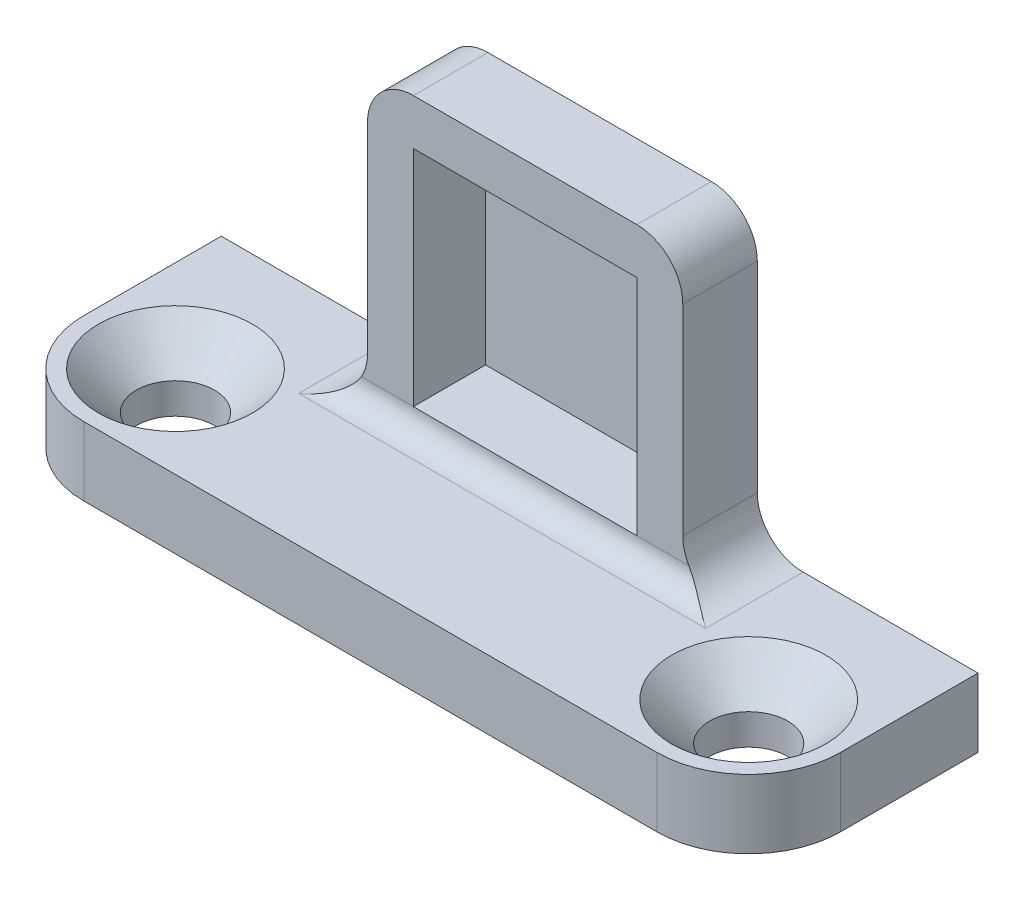
ISO-10303-21;
HEADER;
FILE_DESCRIPTION(('STEP AP214'),'2;1');
FILE_NAME('part.step','',(''),(''),'','','');
FILE_SCHEMA(('AUTOMOTIVE_DESIGN { 1 0 10303 214 1 1 1 1 }'));
ENDSEC;
DATA;
#1=APPLICATION_CONTEXT('core data for automotive mechanical design processes');
#2=APPLICATION_PROTOCOL_DEFINITION('international standard','automotive_design',2000,#1);
#3=PRODUCT_CONTEXT('',#1,'mechanical');
#4=PRODUCT('Part','Part','',(#3));
#5=PRODUCT_RELATED_PRODUCT_CATEGORY('part','',(#4));
#6=PRODUCT_DEFINITION_FORMATION('','',#4);
#7=PRODUCT_DEFINITION_CONTEXT('part definition',#1,'design');
#8=PRODUCT_DEFINITION('design','',#6,#7);
#9=PRODUCT_DEFINITION_SHAPE('','',#8);
#10=(LENGTH_UNIT() NAMED_UNIT(*) SI_UNIT(.MILLI.,.METRE.));
#11=(NAMED_UNIT(*) PLANE_ANGLE_UNIT() SI_UNIT($,.RADIAN.));
#12=(NAMED_UNIT(*) SI_UNIT($,.STERADIAN.) SOLID_ANGLE_UNIT());
#13=UNCERTAINTY_MEASURE_WITH_UNIT(LENGTH_MEASURE(1.E-05),#10,'distance_accuracy_value','');
#14=(GEOMETRIC_REPRESENTATION_CONTEXT(3) GLOBAL_UNCERTAINTY_ASSIGNED_CONTEXT((#13)) GLOBAL_UNIT_ASSIGNED_CONTEXT((#10,
#11,#12)) REPRESENTATION_CONTEXT('',''));
#15=CARTESIAN_POINT('',(0.,0.,0.));
#16=DIRECTION('',(0.,0.,1.));
#17=DIRECTION('',(1.,0.,0.));
#18=AXIS2_PLACEMENT_3D('',#15,#16,#17);
#19=CARTESIAN_POINT('',(16.5,3.,0.));
#20=DIRECTION('',(1.,0.,0.));
#21=DIRECTION('',(0.,0.,-1.));
#22=AXIS2_PLACEMENT_3D('',#19,#20,#21);
#23=PLANE('',#22);
#24=DIRECTION('',(0.,0.,1.));
#25=VECTOR('',#24,1.);
#26=CARTESIAN_POINT('',(16.5,3.,0.));
#27=LINE('',#26,#25);
#28=CARTESIAN_POINT('',(16.5,3.,0.));
#29=VERTEX_POINT('',#28);
#30=CARTESIAN_POINT('',(16.5,3.,6.));
#31=VERTEX_POINT('',#30);
#32=EDGE_CURVE('E247',#29,#31,#27,.T.);
#33=ORIENTED_EDGE('',*,*,#32,.T.);
#34=DIRECTION('',(0.,-1.,0.));
#35=VECTOR('',#34,1.);
#36=CARTESIAN_POINT('',(16.5,0.,6.));
#37=LINE('',#36,#35);
#38=CARTESIAN_POINT('',(16.5,0.,6.));
#39=VERTEX_POINT('',#38);
#40=EDGE_CURVE('E295',#31,#39,#37,.T.);
#41=ORIENTED_EDGE('',*,*,#40,.T.);
#42=DIRECTION('',(0.,0.,1.));
#43=VECTOR('',#42,1.);
#44=CARTESIAN_POINT('',(16.5,0.,0.));
#45=LINE('',#44,#43);
#46=CARTESIAN_POINT('',(16.5,0.,0.));
#47=VERTEX_POINT('',#46);
#48=EDGE_CURVE('E262',#47,#39,#45,.T.);
#49=ORIENTED_EDGE('',*,*,#48,.F.);
#50=DIRECTION('',(0.,-1.,0.));
#51=VECTOR('',#50,1.);
#52=CARTESIAN_POINT('',(16.5,3.,0.));
#53=LINE('',#52,#51);
#54=EDGE_CURVE('E274',#29,#47,#53,.T.);
#55=ORIENTED_EDGE('',*,*,#54,.F.);
#56=EDGE_LOOP('',(#33,#41,#49,#55));
#57=FACE_BOUND('',#56,.T.);
#58=ADVANCED_FACE('F35',(#57),#23,.T.);
#59=CARTESIAN_POINT('',(0.,3.,0.));
#60=DIRECTION('',(0.,0.,-1.));
#61=DIRECTION('',(-1.,0.,0.));
#62=AXIS2_PLACEMENT_3D('',#59,#60,#61);
#63=PLANE('',#62);
#64=DIRECTION('',(0.,1.,0.));
#65=VECTOR('',#64,1.);
#66=CARTESIAN_POINT('',(-6.875,3.,0.));
#67=LINE('',#66,#65);
#68=CARTESIAN_POINT('',(-6.875,5.,0.));
#69=VERTEX_POINT('',#68);
#70=CARTESIAN_POINT('',(-6.875,13.75,0.));
#71=VERTEX_POINT('',#70);
#72=EDGE_CURVE('E211',#69,#71,#67,.T.);
#73=ORIENTED_EDGE('',*,*,#72,.T.);
#74=CARTESIAN_POINT('',(-4.875,13.75,0.));
#75=DIRECTION('',(0.,0.,-1.));
#76=DIRECTION('',(-1.,0.,0.));
#77=AXIS2_PLACEMENT_3D('',#74,#75,#76);
#78=CIRCLE('',#77,2.);
#79=CARTESIAN_POINT('',(-4.875,15.75,0.));
#80=VERTEX_POINT('',#79);
#81=EDGE_CURVE('E315',#71,#80,#78,.T.);
#82=ORIENTED_EDGE('',*,*,#81,.T.);
#83=DIRECTION('',(1.,0.,0.));
#84=VECTOR('',#83,1.);
#85=CARTESIAN_POINT('',(6.875,15.75,0.));
#86=LINE('',#85,#84);
#87=CARTESIAN_POINT('',(4.875,15.75,0.));
#88=VERTEX_POINT('',#87);
#89=EDGE_CURVE('E229',#80,#88,#86,.T.);
#90=ORIENTED_EDGE('',*,*,#89,.T.);
#91=CARTESIAN_POINT('',(4.875,13.75,0.));
#92=DIRECTION('',(0.,0.,-1.));
#93=DIRECTION('',(-1.,0.,0.));
#94=AXIS2_PLACEMENT_3D('',#91,#92,#93);
#95=CIRCLE('',#94,2.);
#96=CARTESIAN_POINT('',(6.875,13.75,0.));
#97=VERTEX_POINT('',#96);
#98=EDGE_CURVE('E313',#88,#97,#95,.T.);
#99=ORIENTED_EDGE('',*,*,#98,.T.);
#100=DIRECTION('',(0.,-1.,0.));
#101=VECTOR('',#100,1.);
#102=CARTESIAN_POINT('',(6.875,3.,0.));
#103=LINE('',#102,#101);
#104=CARTESIAN_POINT('',(6.875,5.,0.));
#105=VERTEX_POINT('',#104);
#106=EDGE_CURVE('E220',#97,#105,#103,.T.);
#107=ORIENTED_EDGE('',*,*,#106,.T.);
#108=CARTESIAN_POINT('',(8.875,5.,0.));
#109=DIRECTION('',(0.,0.,-1.));
#110=DIRECTION('',(-1.,0.,0.));
#111=AXIS2_PLACEMENT_3D('',#108,#109,#110);
#112=CIRCLE('',#111,2.);
#113=CARTESIAN_POINT('',(8.875,3.,0.));
#114=VERTEX_POINT('',#113);
#115=EDGE_CURVE('E330',#105,#114,#112,.F.);
#116=ORIENTED_EDGE('',*,*,#115,.T.);
#117=DIRECTION('',(1.,0.,0.));
#118=VECTOR('',#117,1.);
#119=CARTESIAN_POINT('',(0.,3.,0.));
#120=LINE('',#119,#118);
#121=EDGE_CURVE('E250',#114,#29,#120,.T.);
#122=ORIENTED_EDGE('',*,*,#121,.T.);
#123=ORIENTED_EDGE('',*,*,#54,.T.);
#124=DIRECTION('',(1.,0.,0.));
#125=VECTOR('',#124,1.);
#126=CARTESIAN_POINT('',(0.,0.,0.));
#127=LINE('',#126,#125);
#128=CARTESIAN_POINT('',(-16.5,0.,0.));
#129=VERTEX_POINT('',#128);
#130=EDGE_CURVE('E265',#129,#47,#127,.T.);
#131=ORIENTED_EDGE('',*,*,#130,.F.);
#132=DIRECTION('',(0.,-1.,0.));
#133=VECTOR('',#132,1.);
#134=CARTESIAN_POINT('',(-16.5,3.,0.));
#135=LINE('',#134,#133);
#136=CARTESIAN_POINT('',(-16.5,3.,0.));
#137=VERTEX_POINT('',#136);
#138=EDGE_CURVE('E261',#137,#129,#135,.T.);
#139=ORIENTED_EDGE('',*,*,#138,.F.);
#140=CARTESIAN_POINT('',(-8.875,3.,0.));
#141=VERTEX_POINT('',#140);
#142=EDGE_CURVE('E252',#137,#141,#120,.T.);
#143=ORIENTED_EDGE('',*,*,#142,.T.);
#144=CARTESIAN_POINT('',(-8.875,5.,0.));
#145=DIRECTION('',(0.,0.,-1.));
#146=DIRECTION('',(-1.,0.,0.));
#147=AXIS2_PLACEMENT_3D('',#144,#145,#146);
#148=CIRCLE('',#147,2.);
#149=EDGE_CURVE('E326',#141,#69,#148,.F.);
#150=ORIENTED_EDGE('',*,*,#149,.T.);
#151=EDGE_LOOP('',(#73,#82,#90,#99,#107,#116,#122,#123,#131,#139,#143,#150));
#152=FACE_BOUND('',#151,.T.);
#153=ADVANCED_FACE('F367',(#152),#63,.T.);
#154=CARTESIAN_POINT('',(-16.5,3.,0.));
#155=DIRECTION('',(1.,0.,0.));
#156=DIRECTION('',(0.,0.,-1.));
#157=AXIS2_PLACEMENT_3D('',#154,#155,#156);
#158=PLANE('',#157);
#159=DIRECTION('',(0.,0.,1.));
#160=VECTOR('',#159,1.);
#161=CARTESIAN_POINT('',(-16.5,0.,0.));
#162=LINE('',#161,#160);
#163=CARTESIAN_POINT('',(-16.5,0.,5.99999999999999));
#164=VERTEX_POINT('',#163);
#165=EDGE_CURVE('E268',#129,#164,#162,.T.);
#166=ORIENTED_EDGE('',*,*,#165,.T.);
#167=DIRECTION('',(0.,-1.,0.));
#168=VECTOR('',#167,1.);
#169=CARTESIAN_POINT('',(-16.5,3.,5.99999999999999));
#170=LINE('',#169,#168);
#171=CARTESIAN_POINT('',(-16.5,3.,5.99999999999999));
#172=VERTEX_POINT('',#171);
#173=EDGE_CURVE('E289',#164,#172,#170,.F.);
#174=ORIENTED_EDGE('',*,*,#173,.T.);
#175=DIRECTION('',(0.,0.,1.));
#176=VECTOR('',#175,1.);
#177=CARTESIAN_POINT('',(-16.5,3.,0.));
#178=LINE('',#177,#176);
#179=EDGE_CURVE('E255',#137,#172,#178,.T.);
#180=ORIENTED_EDGE('',*,*,#179,.F.);
#181=ORIENTED_EDGE('',*,*,#138,.T.);
#182=EDGE_LOOP('',(#166,#174,#180,#181));
#183=FACE_BOUND('',#182,.T.);
#184=ADVANCED_FACE('F373',(#183),#158,.F.);
#185=CARTESIAN_POINT('',(0.,3.,9.99999999999999));
#186=DIRECTION('',(0.,0.,-1.));
#187=DIRECTION('',(-1.,0.,0.));
#188=AXIS2_PLACEMENT_3D('',#185,#186,#187);
#189=PLANE('',#188);
#190=DIRECTION('',(1.,0.,0.));
#191=VECTOR('',#190,1.);
#192=CARTESIAN_POINT('',(0.,3.,9.99999999999999));
#193=LINE('',#192,#191);
#194=CARTESIAN_POINT('',(-12.5,3.,9.99999999999999));
#195=VERTEX_POINT('',#194);
#196=CARTESIAN_POINT('',(12.5,3.,10.));
#197=VERTEX_POINT('',#196);
#198=EDGE_CURVE('E258',#195,#197,#193,.T.);
#199=ORIENTED_EDGE('',*,*,#198,.F.);
#200=DIRECTION('',(0.,-1.,0.));
#201=VECTOR('',#200,1.);
#202=CARTESIAN_POINT('',(-12.5,3.,9.99999999999999));
#203=LINE('',#202,#201);
#204=CARTESIAN_POINT('',(-12.5,0.,9.99999999999999));
#205=VERTEX_POINT('',#204);
#206=EDGE_CURVE('E282',#195,#205,#203,.T.);
#207=ORIENTED_EDGE('',*,*,#206,.T.);
#208=DIRECTION('',(1.,0.,0.));
#209=VECTOR('',#208,1.);
#210=CARTESIAN_POINT('',(0.,0.,9.99999999999999));
#211=LINE('',#210,#209);
#212=CARTESIAN_POINT('',(12.5,0.,10.));
#213=VERTEX_POINT('',#212);
#214=EDGE_CURVE('E251',#205,#213,#211,.T.);
#215=ORIENTED_EDGE('',*,*,#214,.T.);
#216=DIRECTION('',(0.,-1.,0.));
#217=VECTOR('',#216,1.);
#218=CARTESIAN_POINT('',(12.5,3.,10.));
#219=LINE('',#218,#217);
#220=EDGE_CURVE('E276',#213,#197,#219,.F.);
#221=ORIENTED_EDGE('',*,*,#220,.T.);
#222=EDGE_LOOP('',(#199,#207,#215,#221));
#223=FACE_BOUND('',#222,.T.);
#224=ADVANCED_FACE('F401',(#223),#189,.F.);
#225=CARTESIAN_POINT('',(0.,3.,0.));
#226=DIRECTION('',(0.,1.,0.));
#227=DIRECTION('',(0.,0.,1.));
#228=AXIS2_PLACEMENT_3D('',#225,#226,#227);
#229=PLANE('',#228);
#230=DIRECTION('',(-1.,0.,0.));
#231=VECTOR('',#230,1.);
#232=CARTESIAN_POINT('',(-8.875,3.,4.25));
#233=LINE('',#232,#231);
#234=CARTESIAN_POINT('',(8.875,3.,4.25));
#235=VERTEX_POINT('',#234);
#236=CARTESIAN_POINT('',(-8.875,3.,4.25));
#237=VERTEX_POINT('',#236);
#238=EDGE_CURVE('E334',#235,#237,#233,.T.);
#239=ORIENTED_EDGE('',*,*,#238,.T.);
#240=DIRECTION('',(0.,0.,-1.));
#241=VECTOR('',#240,1.);
#242=CARTESIAN_POINT('',(-8.875,3.,0.));
#243=LINE('',#242,#241);
#244=EDGE_CURVE('E300',#237,#141,#243,.T.);
#245=ORIENTED_EDGE('',*,*,#244,.T.);
#246=ORIENTED_EDGE('',*,*,#142,.F.);
#247=ORIENTED_EDGE('',*,*,#179,.T.);
#248=CARTESIAN_POINT('',(-12.5,3.,5.99999999999999));
#249=DIRECTION('',(0.,1.,0.));
#250=DIRECTION('',(0.,0.,1.));
#251=AXIS2_PLACEMENT_3D('',#248,#249,#250);
#252=CIRCLE('',#251,4.);
#253=EDGE_CURVE('E293',#172,#195,#252,.T.);
#254=ORIENTED_EDGE('',*,*,#253,.T.);
#255=ORIENTED_EDGE('',*,*,#198,.T.);
#256=CARTESIAN_POINT('',(12.5,3.,6.));
#257=DIRECTION('',(0.,1.,0.));
#258=DIRECTION('',(0.,0.,1.));
#259=AXIS2_PLACEMENT_3D('',#256,#257,#258);
#260=CIRCLE('',#259,4.);
#261=EDGE_CURVE('E291',#197,#31,#260,.T.);
#262=ORIENTED_EDGE('',*,*,#261,.T.);
#263=ORIENTED_EDGE('',*,*,#32,.F.);
#264=ORIENTED_EDGE('',*,*,#121,.F.);
#265=DIRECTION('',(0.,0.,-1.));
#266=VECTOR('',#265,1.);
#267=CARTESIAN_POINT('',(8.875,3.,3.25));
#268=LINE('',#267,#266);
#269=EDGE_CURVE('E298',#114,#235,#268,.F.);
#270=ORIENTED_EDGE('',*,*,#269,.T.);
#271=EDGE_LOOP('',(#239,#245,#246,#247,#254,#255,#262,#263,#264,#270));
#272=FACE_BOUND('',#271,.T.);
#273=CARTESIAN_POINT('',(-12.5,3.,6.));
#274=DIRECTION('',(0.,1.,0.));
#275=DIRECTION('',(0.,0.,1.));
#276=AXIS2_PLACEMENT_3D('',#273,#274,#275);
#277=CIRCLE('',#276,3.36);
#278=CARTESIAN_POINT('',(-12.5,3.,9.36));
#279=VERTEX_POINT('',#278);
#280=EDGE_CURVE('E226',#279,#279,#277,.T.);
#281=ORIENTED_EDGE('',*,*,#280,.F.);
#282=EDGE_LOOP('',(#281));
#283=FACE_BOUND('',#282,.T.);
#284=CARTESIAN_POINT('',(12.5,3.,5.99999999999999));
#285=DIRECTION('',(0.,1.,0.));
#286=DIRECTION('',(0.,0.,1.));
#287=AXIS2_PLACEMENT_3D('',#284,#285,#286);
#288=CIRCLE('',#287,3.36);
#289=CARTESIAN_POINT('',(12.5,3.,9.35999999999999));
#290=VERTEX_POINT('',#289);
#291=EDGE_CURVE('E240',#290,#290,#288,.T.);
#292=ORIENTED_EDGE('',*,*,#291,.F.);
#293=EDGE_LOOP('',(#292));
#294=FACE_BOUND('',#293,.T.);
#295=ADVANCED_FACE('F395',(#272,#283,#294),#229,.T.);
#296=CARTESIAN_POINT('',(0.,0.,0.));
#297=DIRECTION('',(0.,1.,0.));
#298=DIRECTION('',(0.,0.,1.));
#299=AXIS2_PLACEMENT_3D('',#296,#297,#298);
#300=PLANE('',#299);
#301=CARTESIAN_POINT('',(-12.5,0.,6.));
#302=DIRECTION('',(0.,1.,0.));
#303=DIRECTION('',(0.,0.,1.));
#304=AXIS2_PLACEMENT_3D('',#301,#302,#303);
#305=CIRCLE('',#304,1.7);
#306=CARTESIAN_POINT('',(-12.5,0.,7.69999999999999));
#307=VERTEX_POINT('',#306);
#308=EDGE_CURVE('E239',#307,#307,#305,.T.);
#309=ORIENTED_EDGE('',*,*,#308,.T.);
#310=EDGE_LOOP('',(#309));
#311=FACE_BOUND('',#310,.T.);
#312=CARTESIAN_POINT('',(12.5,0.,5.99999999999999));
#313=DIRECTION('',(0.,1.,0.));
#314=DIRECTION('',(0.,0.,1.));
#315=AXIS2_PLACEMENT_3D('',#312,#313,#314);
#316=CIRCLE('',#315,1.7);
#317=CARTESIAN_POINT('',(12.5,0.,7.69999999999999));
#318=VERTEX_POINT('',#317);
#319=EDGE_CURVE('E246',#318,#318,#316,.T.);
#320=ORIENTED_EDGE('',*,*,#319,.T.);
#321=EDGE_LOOP('',(#320));
#322=FACE_BOUND('',#321,.T.);
#323=ORIENTED_EDGE('',*,*,#214,.F.);
#324=CARTESIAN_POINT('',(-12.5,0.,5.99999999999999));
#325=DIRECTION('',(0.,1.,0.));
#326=DIRECTION('',(0.,0.,1.));
#327=AXIS2_PLACEMENT_3D('',#324,#325,#326);
#328=CIRCLE('',#327,4.);
#329=EDGE_CURVE('E287',#205,#164,#328,.F.);
#330=ORIENTED_EDGE('',*,*,#329,.T.);
#331=ORIENTED_EDGE('',*,*,#165,.F.);
#332=ORIENTED_EDGE('',*,*,#130,.T.);
#333=ORIENTED_EDGE('',*,*,#48,.T.);
#334=CARTESIAN_POINT('',(12.5,0.,6.));
#335=DIRECTION('',(0.,1.,0.));
#336=DIRECTION('',(0.,0.,1.));
#337=AXIS2_PLACEMENT_3D('',#334,#335,#336);
#338=CIRCLE('',#337,4.);
#339=EDGE_CURVE('E285',#39,#213,#338,.F.);
#340=ORIENTED_EDGE('',*,*,#339,.T.);
#341=EDGE_LOOP('',(#323,#330,#331,#332,#333,#340));
#342=FACE_BOUND('',#341,.T.);
#343=ADVANCED_FACE('F420',(#311,#322,#342),#300,.F.);
#344=CARTESIAN_POINT('',(12.5,3.,5.99999999999999));
#345=DIRECTION('',(0.,1.,0.));
#346=DIRECTION('',(0.,0.,1.));
#347=AXIS2_PLACEMENT_3D('',#344,#345,#346);
#348=CYLINDRICAL_SURFACE('',#347,1.7);
#349=CARTESIAN_POINT('',(12.5,1.34,5.99999999999999));
#350=DIRECTION('',(0.,1.,0.));
#351=DIRECTION('',(0.,0.,1.));
#352=AXIS2_PLACEMENT_3D('',#349,#350,#351);
#353=CIRCLE('',#352,1.7);
#354=CARTESIAN_POINT('',(12.5,1.34,7.69999999999999));
#355=VERTEX_POINT('',#354);
#356=EDGE_CURVE('E243',#355,#355,#353,.T.);
#357=ORIENTED_EDGE('',*,*,#356,.T.);
#358=EDGE_LOOP('',(#357));
#359=FACE_BOUND('',#358,.T.);
#360=ORIENTED_EDGE('',*,*,#319,.F.);
#361=EDGE_LOOP('',(#360));
#362=FACE_BOUND('',#361,.T.);
#363=ADVANCED_FACE('F422',(#359,#362),#348,.F.);
#364=CARTESIAN_POINT('',(12.5,3.,5.99999999999999));
#365=DIRECTION('',(0.,1.,0.));
#366=DIRECTION('',(0.,0.,1.));
#367=AXIS2_PLACEMENT_3D('',#364,#365,#366);
#368=CONICAL_SURFACE('',#367,3.36,0.785398163397448);
#369=ORIENTED_EDGE('',*,*,#356,.F.);
#370=EDGE_LOOP('',(#369));
#371=FACE_BOUND('',#370,.T.);
#372=ORIENTED_EDGE('',*,*,#291,.T.);
#373=EDGE_LOOP('',(#372));
#374=FACE_BOUND('',#373,.T.);
#375=ADVANCED_FACE('F429',(#371,#374),#368,.F.);
#376=CARTESIAN_POINT('',(-12.5,3.,6.));
#377=DIRECTION('',(0.,1.,0.));
#378=DIRECTION('',(0.,0.,1.));
#379=AXIS2_PLACEMENT_3D('',#376,#377,#378);
#380=CYLINDRICAL_SURFACE('',#379,1.7);
#381=CARTESIAN_POINT('',(-12.5,1.34,6.));
#382=DIRECTION('',(0.,1.,0.));
#383=DIRECTION('',(0.,0.,1.));
#384=AXIS2_PLACEMENT_3D('',#381,#382,#383);
#385=CIRCLE('',#384,1.7);
#386=CARTESIAN_POINT('',(-12.5,1.34,7.69999999999999));
#387=VERTEX_POINT('',#386);
#388=EDGE_CURVE('E236',#387,#387,#385,.T.);
#389=ORIENTED_EDGE('',*,*,#388,.T.);
#390=EDGE_LOOP('',(#389));
#391=FACE_BOUND('',#390,.T.);
#392=ORIENTED_EDGE('',*,*,#308,.F.);
#393=EDGE_LOOP('',(#392));
#394=FACE_BOUND('',#393,.T.);
#395=ADVANCED_FACE('F387',(#391,#394),#380,.F.);
#396=CARTESIAN_POINT('',(-12.5,3.,6.));
#397=DIRECTION('',(0.,1.,0.));
#398=DIRECTION('',(0.,0.,1.));
#399=AXIS2_PLACEMENT_3D('',#396,#397,#398);
#400=CONICAL_SURFACE('',#399,3.36,0.785398163397448);
#401=ORIENTED_EDGE('',*,*,#388,.F.);
#402=EDGE_LOOP('',(#401));
#403=FACE_BOUND('',#402,.T.);
#404=ORIENTED_EDGE('',*,*,#280,.T.);
#405=EDGE_LOOP('',(#404));
#406=FACE_BOUND('',#405,.T.);
#407=ADVANCED_FACE('F379',(#403,#406),#400,.F.);
#408=CARTESIAN_POINT('',(-12.5,3.,5.99999999999999));
#409=DIRECTION('',(0.,-1.,0.));
#410=DIRECTION('',(0.,0.,-1.));
#411=AXIS2_PLACEMENT_3D('',#408,#409,#410);
#412=CYLINDRICAL_SURFACE('',#411,4.);
#413=ORIENTED_EDGE('',*,*,#253,.F.);
#414=ORIENTED_EDGE('',*,*,#173,.F.);
#415=ORIENTED_EDGE('',*,*,#329,.F.);
#416=ORIENTED_EDGE('',*,*,#206,.F.);
#417=EDGE_LOOP('',(#413,#414,#415,#416));
#418=FACE_BOUND('',#417,.T.);
#419=ADVANCED_FACE('F377',(#418),#412,.T.);
#420=CARTESIAN_POINT('',(12.5,3.,6.));
#421=DIRECTION('',(0.,1.,0.));
#422=DIRECTION('',(0.,0.,1.));
#423=AXIS2_PLACEMENT_3D('',#420,#421,#422);
#424=CYLINDRICAL_SURFACE('',#423,4.);
#425=ORIENTED_EDGE('',*,*,#261,.F.);
#426=ORIENTED_EDGE('',*,*,#220,.F.);
#427=ORIENTED_EDGE('',*,*,#339,.F.);
#428=ORIENTED_EDGE('',*,*,#40,.F.);
#429=EDGE_LOOP('',(#425,#426,#427,#428));
#430=FACE_BOUND('',#429,.T.);
#431=ADVANCED_FACE('F349',(#430),#424,.T.);
#432=CARTESIAN_POINT('',(-6.875,3.,3.25));
#433=DIRECTION('',(-1.,0.,0.));
#434=DIRECTION('',(0.,0.,1.));
#435=AXIS2_PLACEMENT_3D('',#432,#433,#434);
#436=PLANE('',#435);
#437=ORIENTED_EDGE('',*,*,#72,.F.);
#438=DIRECTION('',(0.,0.,-1.));
#439=VECTOR('',#438,1.);
#440=CARTESIAN_POINT('',(-6.875,5.,3.25));
#441=LINE('',#440,#439);
#442=CARTESIAN_POINT('',(-6.875,5.,3.25));
#443=VERTEX_POINT('',#442);
#444=EDGE_CURVE('E306',#69,#443,#441,.F.);
#445=ORIENTED_EDGE('',*,*,#444,.T.);
#446=DIRECTION('',(0.,1.,0.));
#447=VECTOR('',#446,1.);
#448=CARTESIAN_POINT('',(-6.875,3.,3.25));
#449=LINE('',#448,#447);
#450=CARTESIAN_POINT('',(-6.875,13.75,3.25));
#451=VERTEX_POINT('',#450);
#452=EDGE_CURVE('E216',#443,#451,#449,.T.);
#453=ORIENTED_EDGE('',*,*,#452,.T.);
#454=DIRECTION('',(0.,0.,-1.));
#455=VECTOR('',#454,1.);
#456=CARTESIAN_POINT('',(-6.875,13.75,3.25));
#457=LINE('',#456,#455);
#458=EDGE_CURVE('E303',#451,#71,#457,.T.);
#459=ORIENTED_EDGE('',*,*,#458,.T.);
#460=EDGE_LOOP('',(#437,#445,#453,#459));
#461=FACE_BOUND('',#460,.T.);
#462=ADVANCED_FACE('F385',(#461),#436,.T.);
#463=CARTESIAN_POINT('',(6.875,3.,3.25));
#464=DIRECTION('',(1.,0.,0.));
#465=DIRECTION('',(0.,1.,0.));
#466=AXIS2_PLACEMENT_3D('',#463,#464,#465);
#467=PLANE('',#466);
#468=DIRECTION('',(0.,-1.,0.));
#469=VECTOR('',#468,1.);
#470=CARTESIAN_POINT('',(6.875,3.,3.25));
#471=LINE('',#470,#469);
#472=CARTESIAN_POINT('',(6.875,13.75,3.25));
#473=VERTEX_POINT('',#472);
#474=CARTESIAN_POINT('',(6.875,5.,3.25));
#475=VERTEX_POINT('',#474);
#476=EDGE_CURVE('E223',#473,#475,#471,.T.);
#477=ORIENTED_EDGE('',*,*,#476,.T.);
#478=DIRECTION('',(0.,0.,-1.));
#479=VECTOR('',#478,1.);
#480=CARTESIAN_POINT('',(6.875,5.,0.));
#481=LINE('',#480,#479);
#482=EDGE_CURVE('E310',#475,#105,#481,.T.);
#483=ORIENTED_EDGE('',*,*,#482,.T.);
#484=ORIENTED_EDGE('',*,*,#106,.F.);
#485=DIRECTION('',(0.,0.,-1.));
#486=VECTOR('',#485,1.);
#487=CARTESIAN_POINT('',(6.875,13.75,3.25));
#488=LINE('',#487,#486);
#489=EDGE_CURVE('E308',#97,#473,#488,.F.);
#490=ORIENTED_EDGE('',*,*,#489,.T.);
#491=EDGE_LOOP('',(#477,#483,#484,#490));
#492=FACE_BOUND('',#491,.T.);
#493=ADVANCED_FACE('F529',(#492),#467,.T.);
#494=CARTESIAN_POINT('',(6.875,15.75,3.25));
#495=DIRECTION('',(0.,1.,0.));
#496=DIRECTION('',(0.,0.,1.));
#497=AXIS2_PLACEMENT_3D('',#494,#495,#496);
#498=PLANE('',#497);
#499=ORIENTED_EDGE('',*,*,#89,.F.);
#500=DIRECTION('',(0.,0.,-1.));
#501=VECTOR('',#500,1.);
#502=CARTESIAN_POINT('',(-4.875,15.75,3.25));
#503=LINE('',#502,#501);
#504=CARTESIAN_POINT('',(-4.875,15.75,3.25));
#505=VERTEX_POINT('',#504);
#506=EDGE_CURVE('E320',#80,#505,#503,.F.);
#507=ORIENTED_EDGE('',*,*,#506,.T.);
#508=DIRECTION('',(1.,0.,0.));
#509=VECTOR('',#508,1.);
#510=CARTESIAN_POINT('',(6.875,15.75,3.25));
#511=LINE('',#510,#509);
#512=CARTESIAN_POINT('',(4.875,15.75,3.25));
#513=VERTEX_POINT('',#512);
#514=EDGE_CURVE('E219',#505,#513,#511,.T.);
#515=ORIENTED_EDGE('',*,*,#514,.T.);
#516=DIRECTION('',(0.,0.,-1.));
#517=VECTOR('',#516,1.);
#518=CARTESIAN_POINT('',(4.875,15.75,3.25));
#519=LINE('',#518,#517);
#520=EDGE_CURVE('E317',#513,#88,#519,.T.);
#521=ORIENTED_EDGE('',*,*,#520,.T.);
#522=EDGE_LOOP('',(#499,#507,#515,#521));
#523=FACE_BOUND('',#522,.T.);
#524=ADVANCED_FACE('F463',(#523),#498,.T.);
#525=CARTESIAN_POINT('',(0.,0.,3.25));
#526=DIRECTION('',(0.,0.,1.));
#527=DIRECTION('',(1.,0.,0.));
#528=AXIS2_PLACEMENT_3D('',#525,#526,#527);
#529=PLANE('',#528);
#530=CARTESIAN_POINT('',(-8.875,5.,3.25));
#531=DIRECTION('',(0.,0.,1.));
#532=DIRECTION('',(1.,0.,0.));
#533=AXIS2_PLACEMENT_3D('',#530,#531,#532);
#534=CIRCLE('',#533,2.);
#535=CARTESIAN_POINT('',(-7.14294919243113,4.,3.25));
#536=VERTEX_POINT('',#535);
#537=EDGE_CURVE('E328',#443,#536,#534,.F.);
#538=ORIENTED_EDGE('',*,*,#537,.T.);
#539=DIRECTION('',(-1.,0.,0.));
#540=VECTOR('',#539,1.);
#541=CARTESIAN_POINT('',(8.875,4.,3.25));
#542=LINE('',#541,#540);
#543=CARTESIAN_POINT('',(-4.875,4.,3.25));
#544=VERTEX_POINT('',#543);
#545=EDGE_CURVE('E338',#536,#544,#542,.F.);
#546=ORIENTED_EDGE('',*,*,#545,.T.);
#547=DIRECTION('',(0.,-1.,0.));
#548=VECTOR('',#547,1.);
#549=CARTESIAN_POINT('',(-4.875,13.75,3.25));
#550=LINE('',#549,#548);
#551=CARTESIAN_POINT('',(-4.875,13.75,3.25));
#552=VERTEX_POINT('',#551);
#553=EDGE_CURVE('E199',#552,#544,#550,.T.);
#554=ORIENTED_EDGE('',*,*,#553,.F.);
#555=DIRECTION('',(-1.,0.,0.));
#556=VECTOR('',#555,1.);
#557=CARTESIAN_POINT('',(4.875,13.75,3.25));
#558=LINE('',#557,#556);
#559=CARTESIAN_POINT('',(4.875,13.75,3.25));
#560=VERTEX_POINT('',#559);
#561=EDGE_CURVE('E205',#560,#552,#558,.T.);
#562=ORIENTED_EDGE('',*,*,#561,.F.);
#563=DIRECTION('',(0.,1.,0.));
#564=VECTOR('',#563,1.);
#565=CARTESIAN_POINT('',(4.875,13.75,3.25));
#566=LINE('',#565,#564);
#567=CARTESIAN_POINT('',(4.875,4.,3.25));
#568=VERTEX_POINT('',#567);
#569=EDGE_CURVE('E179',#568,#560,#566,.T.);
#570=ORIENTED_EDGE('',*,*,#569,.F.);
#571=DIRECTION('',(-1.,0.,0.));
#572=VECTOR('',#571,1.);
#573=CARTESIAN_POINT('',(8.875,4.,3.25));
#574=LINE('',#573,#572);
#575=CARTESIAN_POINT('',(7.14294919243112,4.,3.25));
#576=VERTEX_POINT('',#575);
#577=EDGE_CURVE('E56',#568,#576,#574,.F.);
#578=ORIENTED_EDGE('',*,*,#577,.T.);
#579=CARTESIAN_POINT('',(8.875,5.,3.25));
#580=DIRECTION('',(0.,0.,1.));
#581=DIRECTION('',(1.,0.,0.));
#582=AXIS2_PLACEMENT_3D('',#579,#580,#581);
#583=CIRCLE('',#582,2.);
#584=EDGE_CURVE('E332',#576,#475,#583,.F.);
#585=ORIENTED_EDGE('',*,*,#584,.T.);
#586=ORIENTED_EDGE('',*,*,#476,.F.);
#587=CARTESIAN_POINT('',(4.875,13.75,3.25));
#588=DIRECTION('',(0.,0.,1.));
#589=DIRECTION('',(1.,0.,0.));
#590=AXIS2_PLACEMENT_3D('',#587,#588,#589);
#591=CIRCLE('',#590,2.);
#592=EDGE_CURVE('E322',#473,#513,#591,.T.);
#593=ORIENTED_EDGE('',*,*,#592,.T.);
#594=ORIENTED_EDGE('',*,*,#514,.F.);
#595=CARTESIAN_POINT('',(-4.875,13.75,3.25));
#596=DIRECTION('',(0.,0.,1.));
#597=DIRECTION('',(1.,0.,0.));
#598=AXIS2_PLACEMENT_3D('',#595,#596,#597);
#599=CIRCLE('',#598,2.);
#600=EDGE_CURVE('E324',#505,#451,#599,.T.);
#601=ORIENTED_EDGE('',*,*,#600,.T.);
#602=ORIENTED_EDGE('',*,*,#452,.F.);
#603=EDGE_LOOP('',(#538,#546,#554,#562,#570,#578,#585,#586,#593,#594,#601,#602));
#604=FACE_BOUND('',#603,.T.);
#605=ADVANCED_FACE('F458',(#604),#529,.T.);
#606=CARTESIAN_POINT('',(4.875,13.75,0.0999999999999998));
#607=DIRECTION('',(1.,0.,0.));
#608=DIRECTION('',(0.,1.,0.));
#609=AXIS2_PLACEMENT_3D('',#606,#607,#608);
#610=PLANE('',#609);
#611=ORIENTED_EDGE('',*,*,#569,.T.);
#612=DIRECTION('',(0.,0.,1.));
#613=VECTOR('',#612,1.);
#614=CARTESIAN_POINT('',(4.875,13.75,0.0999999999999998));
#615=LINE('',#614,#613);
#616=CARTESIAN_POINT('',(4.875,13.75,0.0999999999999998));
#617=VERTEX_POINT('',#616);
#618=EDGE_CURVE('E173',#617,#560,#615,.T.);
#619=ORIENTED_EDGE('',*,*,#618,.F.);
#620=DIRECTION('',(0.,1.,0.));
#621=VECTOR('',#620,1.);
#622=CARTESIAN_POINT('',(4.875,13.75,0.0999999999999998));
#623=LINE('',#622,#621);
#624=CARTESIAN_POINT('',(4.875,4.,0.0999999999999998));
#625=VERTEX_POINT('',#624);
#626=EDGE_CURVE('E177',#625,#617,#623,.T.);
#627=ORIENTED_EDGE('',*,*,#626,.F.);
#628=DIRECTION('',(0.,0.,1.));
#629=VECTOR('',#628,1.);
#630=CARTESIAN_POINT('',(4.875,4.,0.0999999999999998));
#631=LINE('',#630,#629);
#632=EDGE_CURVE('E209',#625,#568,#631,.T.);
#633=ORIENTED_EDGE('',*,*,#632,.T.);
#634=EDGE_LOOP('',(#611,#619,#627,#633));
#635=FACE_BOUND('',#634,.T.);
#636=ADVANCED_FACE('F175',(#635),#610,.F.);
#637=CARTESIAN_POINT('',(4.875,4.,0.0999999999999998));
#638=DIRECTION('',(0.,-1.,0.));
#639=DIRECTION('',(0.,0.,-1.));
#640=AXIS2_PLACEMENT_3D('',#637,#638,#639);
#641=PLANE('',#640);
#642=DIRECTION('',(1.,0.,0.));
#643=VECTOR('',#642,1.);
#644=CARTESIAN_POINT('',(4.875,4.,3.25));
#645=LINE('',#644,#643);
#646=EDGE_CURVE('E196',#544,#568,#645,.T.);
#647=ORIENTED_EDGE('',*,*,#646,.T.);
#648=ORIENTED_EDGE('',*,*,#632,.F.);
#649=DIRECTION('',(1.,0.,0.));
#650=VECTOR('',#649,1.);
#651=CARTESIAN_POINT('',(4.875,4.,0.0999999999999998));
#652=LINE('',#651,#650);
#653=CARTESIAN_POINT('',(-4.875,4.,0.0999999999999998));
#654=VERTEX_POINT('',#653);
#655=EDGE_CURVE('E184',#654,#625,#652,.T.);
#656=ORIENTED_EDGE('',*,*,#655,.F.);
#657=DIRECTION('',(0.,0.,1.));
#658=VECTOR('',#657,1.);
#659=CARTESIAN_POINT('',(-4.875,4.,0.0999999999999998));
#660=LINE('',#659,#658);
#661=EDGE_CURVE('E212',#654,#544,#660,.T.);
#662=ORIENTED_EDGE('',*,*,#661,.T.);
#663=EDGE_LOOP('',(#647,#648,#656,#662));
#664=FACE_BOUND('',#663,.T.);
#665=ADVANCED_FACE('F474',(#664),#641,.F.);
#666=CARTESIAN_POINT('',(-4.875,13.75,0.0999999999999998));
#667=DIRECTION('',(-1.,0.,0.));
#668=DIRECTION('',(0.,-1.,0.));
#669=AXIS2_PLACEMENT_3D('',#666,#667,#668);
#670=PLANE('',#669);
#671=ORIENTED_EDGE('',*,*,#553,.T.);
#672=ORIENTED_EDGE('',*,*,#661,.F.);
#673=DIRECTION('',(0.,-1.,0.));
#674=VECTOR('',#673,1.);
#675=CARTESIAN_POINT('',(-4.875,13.75,0.0999999999999998));
#676=LINE('',#675,#674);
#677=CARTESIAN_POINT('',(-4.875,13.75,0.0999999999999998));
#678=VERTEX_POINT('',#677);
#679=EDGE_CURVE('E192',#678,#654,#676,.T.);
#680=ORIENTED_EDGE('',*,*,#679,.F.);
#681=DIRECTION('',(0.,0.,1.));
#682=VECTOR('',#681,1.);
#683=CARTESIAN_POINT('',(-4.875,13.75,0.0999999999999998));
#684=LINE('',#683,#682);
#685=EDGE_CURVE('E183',#678,#552,#684,.T.);
#686=ORIENTED_EDGE('',*,*,#685,.T.);
#687=EDGE_LOOP('',(#671,#672,#680,#686));
#688=FACE_BOUND('',#687,.T.);
#689=ADVANCED_FACE('F483',(#688),#670,.F.);
#690=CARTESIAN_POINT('',(4.875,13.75,0.0999999999999998));
#691=DIRECTION('',(0.,1.,0.));
#692=DIRECTION('',(0.,0.,1.));
#693=AXIS2_PLACEMENT_3D('',#690,#691,#692);
#694=PLANE('',#693);
#695=ORIENTED_EDGE('',*,*,#561,.T.);
#696=ORIENTED_EDGE('',*,*,#685,.F.);
#697=DIRECTION('',(-1.,0.,0.));
#698=VECTOR('',#697,1.);
#699=CARTESIAN_POINT('',(4.875,13.75,0.0999999999999998));
#700=LINE('',#699,#698);
#701=EDGE_CURVE('E187',#617,#678,#700,.T.);
#702=ORIENTED_EDGE('',*,*,#701,.F.);
#703=ORIENTED_EDGE('',*,*,#618,.T.);
#704=EDGE_LOOP('',(#695,#696,#702,#703));
#705=FACE_BOUND('',#704,.T.);
#706=ADVANCED_FACE('F188',(#705),#694,.F.);
#707=CARTESIAN_POINT('',(0.,0.,0.0999999999999998));
#708=DIRECTION('',(0.,0.,-1.));
#709=DIRECTION('',(-1.,0.,0.));
#710=AXIS2_PLACEMENT_3D('',#707,#708,#709);
#711=PLANE('',#710);
#712=ORIENTED_EDGE('',*,*,#626,.T.);
#713=ORIENTED_EDGE('',*,*,#701,.T.);
#714=ORIENTED_EDGE('',*,*,#679,.T.);
#715=ORIENTED_EDGE('',*,*,#655,.T.);
#716=EDGE_LOOP('',(#712,#713,#714,#715));
#717=FACE_BOUND('',#716,.T.);
#718=ADVANCED_FACE('F194',(#717),#711,.F.);
#719=CARTESIAN_POINT('',(-8.875,5.,0.));
#720=DIRECTION('',(0.,0.,1.));
#721=DIRECTION('',(1.,0.,0.));
#722=AXIS2_PLACEMENT_3D('',#719,#720,#721);
#723=CYLINDRICAL_SURFACE('',#722,2.);
#724=ORIENTED_EDGE('',*,*,#537,.F.);
#725=ORIENTED_EDGE('',*,*,#444,.F.);
#726=ORIENTED_EDGE('',*,*,#149,.F.);
#727=ORIENTED_EDGE('',*,*,#244,.F.);
#728=CARTESIAN_POINT('',(-7.14294919243113,4.,3.25));
#729=CARTESIAN_POINT('',(-7.16456119077684,3.96254044047365,3.24999980568836));
#730=CARTESIAN_POINT('',(-7.18738496198315,3.92583917864711,3.25210319796198));
#731=CARTESIAN_POINT('',(-7.2350917210063,3.85434356320049,3.26001340764259));
#732=CARTESIAN_POINT('',(-7.25996935201582,3.81954461931415,3.26581084038911));
#733=CARTESIAN_POINT('',(-7.31119040135561,3.75249844515592,3.28051235919617));
#734=CARTESIAN_POINT('',(-7.33751003404477,3.72022351684429,3.28937426984246));
#735=CARTESIAN_POINT('',(-7.3916543858414,3.65783971793181,3.3097852158221));
#736=CARTESIAN_POINT('',(-7.41948020246429,3.62773246511539,3.32133623142663));
#737=CARTESIAN_POINT('',(-7.51564684920934,3.52980188192177,3.36423276751056));
#738=CARTESIAN_POINT('',(-7.58698065113304,3.46717437431735,3.40092150342509));
#739=CARTESIAN_POINT('',(-7.73463626052194,3.35431082904296,3.48318766839412));
#740=CARTESIAN_POINT('',(-7.81098566230024,3.30415214096292,3.52881758821574));
#741=CARTESIAN_POINT('',(-7.99839927291761,3.19794475890171,3.64566540445564));
#742=CARTESIAN_POINT('',(-8.11099063977572,3.1477495749302,3.71975815567176));
#743=CARTESIAN_POINT('',(-8.33910128882741,3.06936277484821,3.87397939495328));
#744=CARTESIAN_POINT('',(-8.45461658619791,3.04114271871491,3.95409993406185));
#745=CARTESIAN_POINT('',(-8.66947174018588,3.00809073030031,4.1046835611499));
#746=CARTESIAN_POINT('',(-8.76862557205976,3.00037489576334,4.17478225234926));
#747=CARTESIAN_POINT('',(-8.8701314049216,3.00000444910877,4.24655738388493));
#748=CARTESIAN_POINT('',(-8.8725657315113,3.00000000518405,4.24827871283066));
#749=CARTESIAN_POINT('',(-8.875,3.,4.25));
#750=B_SPLINE_CURVE_WITH_KNOTS('',3,(#728,#729,#730,#731,#732,#733,#734,#735,#736,#737,#738,
#739,#740,#741,#742,#743,#744,#745,#746,#747,#748,#749),.UNSPECIFIED.,.F.,.F.,(4,2,2,2,2,2,2,2,
2,2,4),(0.,0.12959229529458,0.258856668652771,0.386408509268408,0.514054578529991,
0.817592410147224,1.1229686971365,1.55212503753218,1.98072504008937,2.34472916750579,
2.35367344935465),.UNSPECIFIED.);
#751=EDGE_CURVE('E49',#237,#536,#750,.F.);
#752=ORIENTED_EDGE('',*,*,#751,.T.);
#753=EDGE_LOOP('',(#724,#725,#726,#727,#752));
#754=FACE_BOUND('',#753,.T.);
#755=ADVANCED_FACE('F344',(#754),#723,.F.);
#756=CARTESIAN_POINT('',(8.875,5.,3.25));
#757=DIRECTION('',(0.,0.,1.));
#758=DIRECTION('',(1.,0.,0.));
#759=AXIS2_PLACEMENT_3D('',#756,#757,#758);
#760=CYLINDRICAL_SURFACE('',#759,2.);
#761=ORIENTED_EDGE('',*,*,#584,.F.);
#762=CARTESIAN_POINT('',(7.14294919243112,4.,3.25));
#763=CARTESIAN_POINT('',(7.16456119077684,3.96254044047365,3.24999980568836));
#764=CARTESIAN_POINT('',(7.18738496198315,3.92583917864711,3.25210319796198));
#765=CARTESIAN_POINT('',(7.23509172100629,3.85434356320049,3.26001340764259));
#766=CARTESIAN_POINT('',(7.25996935201582,3.81954461931415,3.26581084038911));
#767=CARTESIAN_POINT('',(7.31119040135561,3.75249844515592,3.28051235919617));
#768=CARTESIAN_POINT('',(7.33751003404477,3.72022351684429,3.28937426984246));
#769=CARTESIAN_POINT('',(7.39165438584139,3.65783971793181,3.3097852158221));
#770=CARTESIAN_POINT('',(7.41948020246429,3.62773246511539,3.32133623142663));
#771=CARTESIAN_POINT('',(7.51564684920934,3.52980188192177,3.36423276751056));
#772=CARTESIAN_POINT('',(7.58698065113304,3.46717437431735,3.40092150342509));
#773=CARTESIAN_POINT('',(7.73463626052194,3.35431082904296,3.48318766839412));
#774=CARTESIAN_POINT('',(7.81098566230024,3.30415214096292,3.52881758821574));
#775=CARTESIAN_POINT('',(7.99839927291761,3.19794475890171,3.64566540445564));
#776=CARTESIAN_POINT('',(8.11099063977571,3.1477495749302,3.71975815567176));
#777=CARTESIAN_POINT('',(8.33910128882741,3.06936277484821,3.87397939495328));
#778=CARTESIAN_POINT('',(8.45461658619791,3.04114271871491,3.95409993406185));
#779=CARTESIAN_POINT('',(8.66947174018588,3.00809073030031,4.1046835611499));
#780=CARTESIAN_POINT('',(8.76862557205976,3.00037489576334,4.17478225234926));
#781=CARTESIAN_POINT('',(8.8701314049216,3.00000444910877,4.24655738388493));
#782=CARTESIAN_POINT('',(8.87256573151129,3.00000000518405,4.24827871283066));
#783=CARTESIAN_POINT('',(8.875,3.,4.25));
#784=B_SPLINE_CURVE_WITH_KNOTS('',3,(#762,#763,#764,#765,#766,#767,#768,#769,#770,#771,#772,
#773,#774,#775,#776,#777,#778,#779,#780,#781,#782,#783),.UNSPECIFIED.,.F.,.F.,(4,2,2,2,2,2,2,2,
2,2,4),(0.,0.12959229529458,0.258856668652771,0.386408509268408,0.514054578529991,
0.817592410147224,1.1229686971365,1.55212503753218,1.98072504008937,2.34472916750579,
2.35367344935465),.UNSPECIFIED.);
#785=EDGE_CURVE('E11',#576,#235,#784,.T.);
#786=ORIENTED_EDGE('',*,*,#785,.T.);
#787=ORIENTED_EDGE('',*,*,#269,.F.);
#788=ORIENTED_EDGE('',*,*,#115,.F.);
#789=ORIENTED_EDGE('',*,*,#482,.F.);
#790=EDGE_LOOP('',(#761,#786,#787,#788,#789));
#791=FACE_BOUND('',#790,.T.);
#792=ADVANCED_FACE('F348',(#791),#760,.F.);
#793=CARTESIAN_POINT('',(-4.875,13.75,3.25));
#794=DIRECTION('',(0.,0.,-1.));
#795=DIRECTION('',(-1.,0.,0.));
#796=AXIS2_PLACEMENT_3D('',#793,#794,#795);
#797=CYLINDRICAL_SURFACE('',#796,2.);
#798=ORIENTED_EDGE('',*,*,#600,.F.);
#799=ORIENTED_EDGE('',*,*,#506,.F.);
#800=ORIENTED_EDGE('',*,*,#81,.F.);
#801=ORIENTED_EDGE('',*,*,#458,.F.);
#802=EDGE_LOOP('',(#798,#799,#800,#801));
#803=FACE_BOUND('',#802,.T.);
#804=ADVANCED_FACE('F354',(#803),#797,.T.);
#805=CARTESIAN_POINT('',(4.875,13.75,3.25));
#806=DIRECTION('',(0.,0.,-1.));
#807=DIRECTION('',(-1.,0.,0.));
#808=AXIS2_PLACEMENT_3D('',#805,#806,#807);
#809=CYLINDRICAL_SURFACE('',#808,2.);
#810=ORIENTED_EDGE('',*,*,#592,.F.);
#811=ORIENTED_EDGE('',*,*,#489,.F.);
#812=ORIENTED_EDGE('',*,*,#98,.F.);
#813=ORIENTED_EDGE('',*,*,#520,.F.);
#814=EDGE_LOOP('',(#810,#811,#812,#813));
#815=FACE_BOUND('',#814,.T.);
#816=ADVANCED_FACE('F357',(#815),#809,.T.);
#817=CARTESIAN_POINT('',(0.,4.,4.25));
#818=DIRECTION('',(1.,0.,0.));
#819=DIRECTION('',(0.,0.,-1.));
#820=AXIS2_PLACEMENT_3D('',#817,#818,#819);
#821=CYLINDRICAL_SURFACE('',#820,1.);
#822=ORIENTED_EDGE('',*,*,#646,.F.);
#823=ORIENTED_EDGE('',*,*,#545,.F.);
#824=ORIENTED_EDGE('',*,*,#751,.F.);
#825=ORIENTED_EDGE('',*,*,#238,.F.);
#826=ORIENTED_EDGE('',*,*,#785,.F.);
#827=ORIENTED_EDGE('',*,*,#577,.F.);
#828=EDGE_LOOP('',(#822,#823,#824,#825,#826,#827));
#829=FACE_BOUND('',#828,.T.);
#830=ADVANCED_FACE('F37',(#829),#821,.F.);
#831=CLOSED_SHELL('',(#58,#153,#184,#224,#295,#343,#363,#375,#395,#407,#419,#431,#462,#493,#524,
#605,#636,#665,#689,#706,#718,#755,#792,#804,#816,#830));
#832=MANIFOLD_SOLID_BREP('B2',#831);
#833=ADVANCED_BREP_SHAPE_REPRESENTATION('',(#18,#832),#14);
#834=SHAPE_DEFINITION_REPRESENTATION(#9,#833);
ENDSEC;
END-ISO-10303-21;
